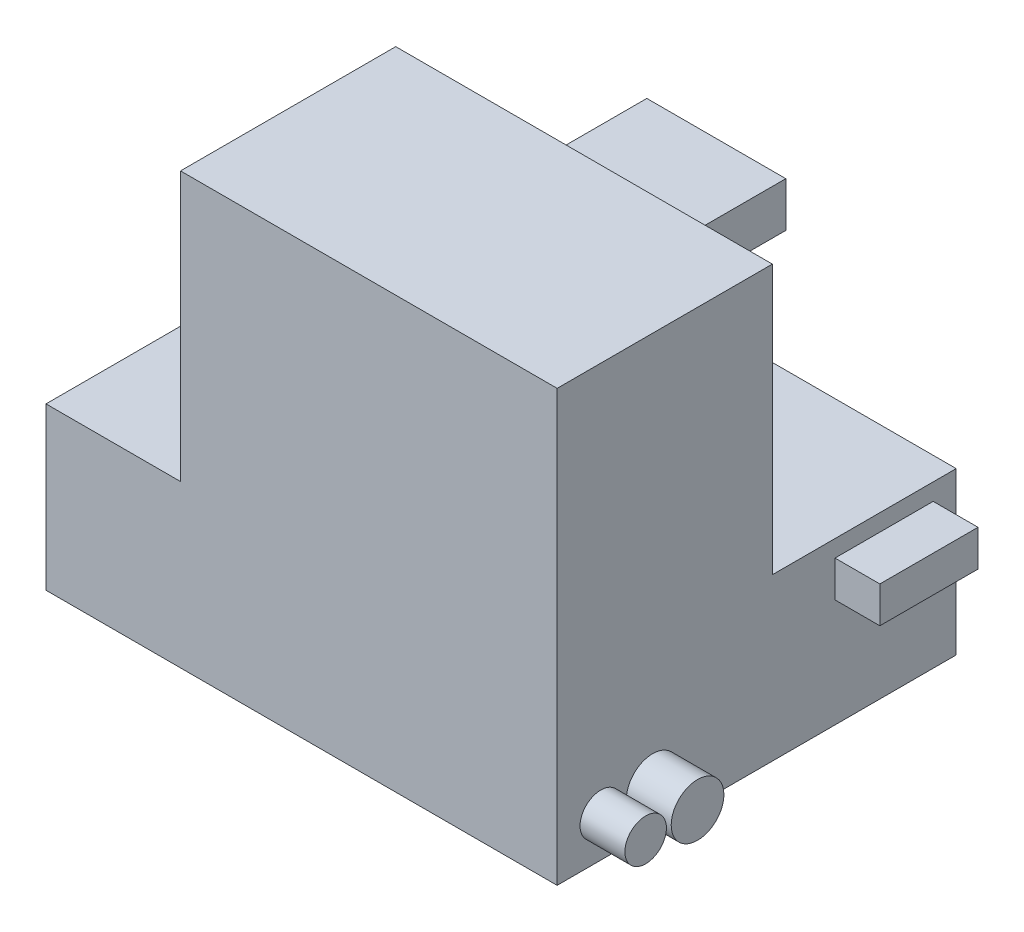
ISO-10303-21;
HEADER;
FILE_DESCRIPTION(('STEP AP214'),'2;1');
FILE_NAME('part.step','',(''),(''),'','','');
FILE_SCHEMA(('AUTOMOTIVE_DESIGN { 1 0 10303 214 1 1 1 1 }'));
ENDSEC;
DATA;
#1=APPLICATION_CONTEXT('core data for automotive mechanical design processes');
#2=APPLICATION_PROTOCOL_DEFINITION('international standard','automotive_design',2000,#1);
#3=PRODUCT_CONTEXT('',#1,'mechanical');
#4=PRODUCT('Part','Part','',(#3));
#5=PRODUCT_RELATED_PRODUCT_CATEGORY('part','',(#4));
#6=PRODUCT_DEFINITION_FORMATION('','',#4);
#7=PRODUCT_DEFINITION_CONTEXT('part definition',#1,'design');
#8=PRODUCT_DEFINITION('design','',#6,#7);
#9=PRODUCT_DEFINITION_SHAPE('','',#8);
#10=(LENGTH_UNIT() NAMED_UNIT(*) SI_UNIT(.MILLI.,.METRE.));
#11=(NAMED_UNIT(*) PLANE_ANGLE_UNIT() SI_UNIT($,.RADIAN.));
#12=(NAMED_UNIT(*) SI_UNIT($,.STERADIAN.) SOLID_ANGLE_UNIT());
#13=UNCERTAINTY_MEASURE_WITH_UNIT(LENGTH_MEASURE(1.E-05),#10,'distance_accuracy_value','');
#14=(GEOMETRIC_REPRESENTATION_CONTEXT(3) GLOBAL_UNCERTAINTY_ASSIGNED_CONTEXT((#13)) GLOBAL_UNIT_ASSIGNED_CONTEXT((#10,
#11,#12)) REPRESENTATION_CONTEXT('',''));
#15=CARTESIAN_POINT('',(0.,0.,0.));
#16=DIRECTION('',(0.,0.,1.));
#17=DIRECTION('',(1.,0.,0.));
#18=AXIS2_PLACEMENT_3D('',#15,#16,#17);
#19=CARTESIAN_POINT('',(0.,18.,-44.5));
#20=DIRECTION('',(0.,0.,1.));
#21=DIRECTION('',(1.,0.,0.));
#22=AXIS2_PLACEMENT_3D('',#19,#20,#21);
#23=PLANE('',#22);
#24=DIRECTION('',(-1.,0.,0.));
#25=VECTOR('',#24,1.);
#26=CARTESIAN_POINT('',(0.,0.,-44.5));
#27=LINE('',#26,#25);
#28=CARTESIAN_POINT('',(57.,0.,-44.5));
#29=VERTEX_POINT('',#28);
#30=CARTESIAN_POINT('',(0.,0.,-44.5));
#31=VERTEX_POINT('',#30);
#32=EDGE_CURVE('E230',#29,#31,#27,.T.);
#33=ORIENTED_EDGE('',*,*,#32,.T.);
#34=DIRECTION('',(0.,-1.,0.));
#35=VECTOR('',#34,1.);
#36=CARTESIAN_POINT('',(0.,18.,-44.5));
#37=LINE('',#36,#35);
#38=CARTESIAN_POINT('',(0.,18.,-44.5));
#39=VERTEX_POINT('',#38);
#40=EDGE_CURVE('E221',#39,#31,#37,.T.);
#41=ORIENTED_EDGE('',*,*,#40,.F.);
#42=DIRECTION('',(-1.,0.,0.));
#43=VECTOR('',#42,1.);
#44=CARTESIAN_POINT('',(0.,18.,-44.5));
#45=LINE('',#44,#43);
#46=CARTESIAN_POINT('',(57.,18.,-44.5));
#47=VERTEX_POINT('',#46);
#48=EDGE_CURVE('E213',#47,#39,#45,.T.);
#49=ORIENTED_EDGE('',*,*,#48,.F.);
#50=DIRECTION('',(0.,-1.,0.));
#51=VECTOR('',#50,1.);
#52=CARTESIAN_POINT('',(57.,18.,-44.5));
#53=LINE('',#52,#51);
#54=EDGE_CURVE('E235',#47,#29,#53,.T.);
#55=ORIENTED_EDGE('',*,*,#54,.T.);
#56=EDGE_LOOP('',(#33,#41,#49,#55));
#57=FACE_BOUND('',#56,.T.);
#58=DIRECTION('',(0.,-1.,0.));
#59=VECTOR('',#58,1.);
#60=CARTESIAN_POINT('',(18.,16.5,-44.5));
#61=LINE('',#60,#59);
#62=CARTESIAN_POINT('',(18.,16.5,-44.5));
#63=VERTEX_POINT('',#62);
#64=CARTESIAN_POINT('',(18.,11.5,-44.5));
#65=VERTEX_POINT('',#64);
#66=EDGE_CURVE('E162',#63,#65,#61,.T.);
#67=ORIENTED_EDGE('',*,*,#66,.F.);
#68=DIRECTION('',(1.,0.,0.));
#69=VECTOR('',#68,1.);
#70=CARTESIAN_POINT('',(18.,16.5,-44.5));
#71=LINE('',#70,#69);
#72=CARTESIAN_POINT('',(2.5,16.5,-44.5));
#73=VERTEX_POINT('',#72);
#74=EDGE_CURVE('E159',#73,#63,#71,.T.);
#75=ORIENTED_EDGE('',*,*,#74,.F.);
#76=DIRECTION('',(0.,1.,0.));
#77=VECTOR('',#76,1.);
#78=CARTESIAN_POINT('',(2.5,16.5,-44.5));
#79=LINE('',#78,#77);
#80=CARTESIAN_POINT('',(2.5,11.5,-44.5));
#81=VERTEX_POINT('',#80);
#82=EDGE_CURVE('E55',#81,#73,#79,.T.);
#83=ORIENTED_EDGE('',*,*,#82,.F.);
#84=DIRECTION('',(-1.,0.,0.));
#85=VECTOR('',#84,1.);
#86=CARTESIAN_POINT('',(18.,11.5,-44.5));
#87=LINE('',#86,#85);
#88=EDGE_CURVE('E50',#65,#81,#87,.T.);
#89=ORIENTED_EDGE('',*,*,#88,.F.);
#90=EDGE_LOOP('',(#67,#75,#83,#89));
#91=FACE_BOUND('',#90,.T.);
#92=ADVANCED_FACE('F33',(#57,#91),#23,.F.);
#93=CARTESIAN_POINT('',(0.,18.,0.));
#94=DIRECTION('',(0.,-1.,0.));
#95=DIRECTION('',(0.,0.,-1.));
#96=AXIS2_PLACEMENT_3D('',#93,#94,#95);
#97=PLANE('',#96);
#98=DIRECTION('',(0.,0.,1.));
#99=VECTOR('',#98,1.);
#100=CARTESIAN_POINT('',(15.,18.,0.));
#101=LINE('',#100,#99);
#102=CARTESIAN_POINT('',(15.,18.,-24.));
#103=VERTEX_POINT('',#102);
#104=CARTESIAN_POINT('',(15.,18.,0.));
#105=VERTEX_POINT('',#104);
#106=EDGE_CURVE('E166',#103,#105,#101,.T.);
#107=ORIENTED_EDGE('',*,*,#106,.F.);
#108=DIRECTION('',(-1.,0.,0.));
#109=VECTOR('',#108,1.);
#110=CARTESIAN_POINT('',(57.,18.,-24.));
#111=LINE('',#110,#109);
#112=CARTESIAN_POINT('',(57.,18.,-24.));
#113=VERTEX_POINT('',#112);
#114=EDGE_CURVE('E163',#113,#103,#111,.T.);
#115=ORIENTED_EDGE('',*,*,#114,.F.);
#116=DIRECTION('',(0.,0.,-1.));
#117=VECTOR('',#116,1.);
#118=CARTESIAN_POINT('',(57.,18.,0.));
#119=LINE('',#118,#117);
#120=EDGE_CURVE('E210',#113,#47,#119,.T.);
#121=ORIENTED_EDGE('',*,*,#120,.T.);
#122=ORIENTED_EDGE('',*,*,#48,.T.);
#123=DIRECTION('',(0.,0.,1.));
#124=VECTOR('',#123,1.);
#125=CARTESIAN_POINT('',(0.,18.,0.));
#126=LINE('',#125,#124);
#127=CARTESIAN_POINT('',(0.,18.,0.));
#128=VERTEX_POINT('',#127);
#129=EDGE_CURVE('E232',#39,#128,#126,.T.);
#130=ORIENTED_EDGE('',*,*,#129,.T.);
#131=DIRECTION('',(1.,0.,0.));
#132=VECTOR('',#131,1.);
#133=CARTESIAN_POINT('',(0.,18.,0.));
#134=LINE('',#133,#132);
#135=EDGE_CURVE('E214',#128,#105,#134,.T.);
#136=ORIENTED_EDGE('',*,*,#135,.T.);
#137=EDGE_LOOP('',(#107,#115,#121,#122,#130,#136));
#138=FACE_BOUND('',#137,.T.);
#139=ADVANCED_FACE('F252',(#138),#97,.F.);
#140=CARTESIAN_POINT('',(57.,18.,0.));
#141=DIRECTION('',(-1.,0.,0.));
#142=DIRECTION('',(0.,0.,1.));
#143=AXIS2_PLACEMENT_3D('',#140,#141,#142);
#144=PLANE('',#143);
#145=CARTESIAN_POINT('',(57.,4.45833877714819,-4.86994873122626));
#146=DIRECTION('',(-1.,0.,0.));
#147=DIRECTION('',(0.,0.,1.));
#148=AXIS2_PLACEMENT_3D('',#145,#146,#147);
#149=CIRCLE('',#148,2.3145559850235);
#150=CARTESIAN_POINT('',(57.,4.45833877714819,-2.55539274620276));
#151=VERTEX_POINT('',#150);
#152=EDGE_CURVE('E42',#151,#151,#149,.F.);
#153=ORIENTED_EDGE('',*,*,#152,.F.);
#154=EDGE_LOOP('',(#153));
#155=FACE_BOUND('',#154,.T.);
#156=DIRECTION('',(0.,0.,-1.));
#157=VECTOR('',#156,1.);
#158=CARTESIAN_POINT('',(57.,0.,0.));
#159=LINE('',#158,#157);
#160=CARTESIAN_POINT('',(57.,0.,0.));
#161=VERTEX_POINT('',#160);
#162=EDGE_CURVE('E228',#161,#29,#159,.T.);
#163=ORIENTED_EDGE('',*,*,#162,.T.);
#164=ORIENTED_EDGE('',*,*,#54,.F.);
#165=ORIENTED_EDGE('',*,*,#120,.F.);
#166=DIRECTION('',(0.,-1.,0.));
#167=VECTOR('',#166,1.);
#168=CARTESIAN_POINT('',(57.,48.,-24.));
#169=LINE('',#168,#167);
#170=CARTESIAN_POINT('',(57.,48.,-24.));
#171=VERTEX_POINT('',#170);
#172=EDGE_CURVE('E197',#171,#113,#169,.T.);
#173=ORIENTED_EDGE('',*,*,#172,.F.);
#174=DIRECTION('',(0.,0.,-1.));
#175=VECTOR('',#174,1.);
#176=CARTESIAN_POINT('',(57.,48.,0.));
#177=LINE('',#176,#175);
#178=CARTESIAN_POINT('',(57.,48.,0.));
#179=VERTEX_POINT('',#178);
#180=EDGE_CURVE('E172',#179,#171,#177,.T.);
#181=ORIENTED_EDGE('',*,*,#180,.F.);
#182=DIRECTION('',(0.,-1.,0.));
#183=VECTOR('',#182,1.);
#184=CARTESIAN_POINT('',(57.,18.,0.));
#185=LINE('',#184,#183);
#186=EDGE_CURVE('E238',#179,#161,#185,.T.);
#187=ORIENTED_EDGE('',*,*,#186,.T.);
#188=EDGE_LOOP('',(#163,#164,#165,#173,#181,#187));
#189=FACE_BOUND('',#188,.T.);
#190=DIRECTION('',(0.,-1.,0.));
#191=VECTOR('',#190,1.);
#192=CARTESIAN_POINT('',(57.,16.1165431801251,-30.9862310302975));
#193=LINE('',#192,#191);
#194=CARTESIAN_POINT('',(57.,16.1165431801251,-30.9862310302975));
#195=VERTEX_POINT('',#194);
#196=CARTESIAN_POINT('',(57.,12.0760948028291,-30.9862310302975));
#197=VERTEX_POINT('',#196);
#198=EDGE_CURVE('E259',#195,#197,#193,.T.);
#199=ORIENTED_EDGE('',*,*,#198,.F.);
#200=DIRECTION('',(0.,0.,1.));
#201=VECTOR('',#200,1.);
#202=CARTESIAN_POINT('',(57.,16.1165431801251,-30.9862310302975));
#203=LINE('',#202,#201);
#204=CARTESIAN_POINT('',(57.,16.1165431801251,-41.9313545719859));
#205=VERTEX_POINT('',#204);
#206=EDGE_CURVE('E321',#205,#195,#203,.T.);
#207=ORIENTED_EDGE('',*,*,#206,.F.);
#208=DIRECTION('',(0.,1.,0.));
#209=VECTOR('',#208,1.);
#210=CARTESIAN_POINT('',(57.,16.1165431801251,-41.9313545719859));
#211=LINE('',#210,#209);
#212=CARTESIAN_POINT('',(57.,12.0760948028291,-41.9313545719859));
#213=VERTEX_POINT('',#212);
#214=EDGE_CURVE('E324',#213,#205,#211,.T.);
#215=ORIENTED_EDGE('',*,*,#214,.F.);
#216=DIRECTION('',(0.,0.,-1.));
#217=VECTOR('',#216,1.);
#218=CARTESIAN_POINT('',(57.,12.0760948028291,-30.9862310302975));
#219=LINE('',#218,#217);
#220=EDGE_CURVE('E327',#197,#213,#219,.T.);
#221=ORIENTED_EDGE('',*,*,#220,.F.);
#222=EDGE_LOOP('',(#199,#207,#215,#221));
#223=FACE_BOUND('',#222,.T.);
#224=CARTESIAN_POINT('',(57.,4.45833877714819,-10.6563386937779));
#225=DIRECTION('',(-1.,0.,0.));
#226=DIRECTION('',(0.,0.,1.));
#227=AXIS2_PLACEMENT_3D('',#224,#225,#226);
#228=CIRCLE('',#227,2.9372509191897);
#229=CARTESIAN_POINT('',(57.,4.45833877714819,-7.71908777458821));
#230=VERTEX_POINT('',#229);
#231=EDGE_CURVE('E11',#230,#230,#228,.F.);
#232=ORIENTED_EDGE('',*,*,#231,.F.);
#233=EDGE_LOOP('',(#232));
#234=FACE_BOUND('',#233,.T.);
#235=ADVANCED_FACE('F249',(#155,#189,#223,#234),#144,.F.);
#236=CARTESIAN_POINT('',(0.,18.,0.));
#237=DIRECTION('',(1.,0.,0.));
#238=DIRECTION('',(0.,0.,-1.));
#239=AXIS2_PLACEMENT_3D('',#236,#237,#238);
#240=PLANE('',#239);
#241=DIRECTION('',(0.,0.,1.));
#242=VECTOR('',#241,1.);
#243=CARTESIAN_POINT('',(0.,0.,0.));
#244=LINE('',#243,#242);
#245=CARTESIAN_POINT('',(0.,0.,0.));
#246=VERTEX_POINT('',#245);
#247=EDGE_CURVE('E222',#31,#246,#244,.T.);
#248=ORIENTED_EDGE('',*,*,#247,.T.);
#249=DIRECTION('',(0.,-1.,0.));
#250=VECTOR('',#249,1.);
#251=CARTESIAN_POINT('',(0.,18.,0.));
#252=LINE('',#251,#250);
#253=EDGE_CURVE('E241',#128,#246,#252,.T.);
#254=ORIENTED_EDGE('',*,*,#253,.F.);
#255=ORIENTED_EDGE('',*,*,#129,.F.);
#256=ORIENTED_EDGE('',*,*,#40,.T.);
#257=EDGE_LOOP('',(#248,#254,#255,#256));
#258=FACE_BOUND('',#257,.T.);
#259=ADVANCED_FACE('F35',(#258),#240,.F.);
#260=CARTESIAN_POINT('',(0.,18.,0.));
#261=DIRECTION('',(0.,0.,-1.));
#262=DIRECTION('',(-1.,0.,0.));
#263=AXIS2_PLACEMENT_3D('',#260,#261,#262);
#264=PLANE('',#263);
#265=DIRECTION('',(1.,0.,0.));
#266=VECTOR('',#265,1.);
#267=CARTESIAN_POINT('',(0.,0.,0.));
#268=LINE('',#267,#266);
#269=EDGE_CURVE('E225',#246,#161,#268,.T.);
#270=ORIENTED_EDGE('',*,*,#269,.T.);
#271=ORIENTED_EDGE('',*,*,#186,.F.);
#272=DIRECTION('',(1.,0.,0.));
#273=VECTOR('',#272,1.);
#274=CARTESIAN_POINT('',(57.,48.,0.));
#275=LINE('',#274,#273);
#276=CARTESIAN_POINT('',(15.,48.,0.));
#277=VERTEX_POINT('',#276);
#278=EDGE_CURVE('E179',#277,#179,#275,.T.);
#279=ORIENTED_EDGE('',*,*,#278,.F.);
#280=DIRECTION('',(0.,-1.,0.));
#281=VECTOR('',#280,1.);
#282=CARTESIAN_POINT('',(15.,48.,0.));
#283=LINE('',#282,#281);
#284=EDGE_CURVE('E182',#277,#105,#283,.T.);
#285=ORIENTED_EDGE('',*,*,#284,.T.);
#286=ORIENTED_EDGE('',*,*,#135,.F.);
#287=ORIENTED_EDGE('',*,*,#253,.T.);
#288=EDGE_LOOP('',(#270,#271,#279,#285,#286,#287));
#289=FACE_BOUND('',#288,.T.);
#290=ADVANCED_FACE('F289',(#289),#264,.F.);
#291=CARTESIAN_POINT('',(0.,0.,0.));
#292=DIRECTION('',(0.,-1.,0.));
#293=DIRECTION('',(0.,0.,-1.));
#294=AXIS2_PLACEMENT_3D('',#291,#292,#293);
#295=PLANE('',#294);
#296=CARTESIAN_POINT('',(53.19,0.,-19.05));
#297=DIRECTION('',(0.,-1.,0.));
#298=DIRECTION('',(0.,0.,-1.));
#299=AXIS2_PLACEMENT_3D('',#296,#297,#298);
#300=CIRCLE('',#299,1.7);
#301=CARTESIAN_POINT('',(53.19,0.,-20.75));
#302=VERTEX_POINT('',#301);
#303=EDGE_CURVE('E574',#302,#302,#300,.T.);
#304=ORIENTED_EDGE('',*,*,#303,.F.);
#305=EDGE_LOOP('',(#304));
#306=FACE_BOUND('',#305,.T.);
#307=CARTESIAN_POINT('',(16.36,0.,-40.64));
#308=DIRECTION('',(0.,-1.,0.));
#309=DIRECTION('',(0.,0.,-1.));
#310=AXIS2_PLACEMENT_3D('',#307,#308,#309);
#311=CIRCLE('',#310,1.7);
#312=CARTESIAN_POINT('',(16.36,0.,-42.34));
#313=VERTEX_POINT('',#312);
#314=EDGE_CURVE('E573',#313,#313,#311,.T.);
#315=ORIENTED_EDGE('',*,*,#314,.F.);
#316=EDGE_LOOP('',(#315));
#317=FACE_BOUND('',#316,.T.);
#318=CARTESIAN_POINT('',(3.66,0.,-3.81));
#319=DIRECTION('',(0.,-1.,0.));
#320=DIRECTION('',(0.,0.,-1.));
#321=AXIS2_PLACEMENT_3D('',#318,#319,#320);
#322=CIRCLE('',#321,1.7);
#323=CARTESIAN_POINT('',(3.66,0.,-5.51));
#324=VERTEX_POINT('',#323);
#325=EDGE_CURVE('E583',#324,#324,#322,.T.);
#326=ORIENTED_EDGE('',*,*,#325,.F.);
#327=EDGE_LOOP('',(#326));
#328=FACE_BOUND('',#327,.T.);
#329=ORIENTED_EDGE('',*,*,#247,.F.);
#330=ORIENTED_EDGE('',*,*,#32,.F.);
#331=ORIENTED_EDGE('',*,*,#162,.F.);
#332=ORIENTED_EDGE('',*,*,#269,.F.);
#333=EDGE_LOOP('',(#329,#330,#331,#332));
#334=FACE_BOUND('',#333,.T.);
#335=ADVANCED_FACE('F288',(#306,#317,#328,#334),#295,.T.);
#336=CARTESIAN_POINT('',(62.,16.1165431801251,-30.9862310302975));
#337=DIRECTION('',(0.,0.,-1.));
#338=DIRECTION('',(-1.,0.,0.));
#339=AXIS2_PLACEMENT_3D('',#336,#337,#338);
#340=PLANE('',#339);
#341=ORIENTED_EDGE('',*,*,#198,.T.);
#342=DIRECTION('',(-1.,0.,0.));
#343=VECTOR('',#342,1.);
#344=CARTESIAN_POINT('',(62.,12.0760948028291,-30.9862310302975));
#345=LINE('',#344,#343);
#346=CARTESIAN_POINT('',(62.,12.0760948028291,-30.9862310302975));
#347=VERTEX_POINT('',#346);
#348=EDGE_CURVE('E226',#347,#197,#345,.T.);
#349=ORIENTED_EDGE('',*,*,#348,.F.);
#350=DIRECTION('',(0.,-1.,0.));
#351=VECTOR('',#350,1.);
#352=CARTESIAN_POINT('',(62.,16.1165431801251,-30.9862310302975));
#353=LINE('',#352,#351);
#354=CARTESIAN_POINT('',(62.,16.1165431801251,-30.9862310302975));
#355=VERTEX_POINT('',#354);
#356=EDGE_CURVE('E323',#355,#347,#353,.T.);
#357=ORIENTED_EDGE('',*,*,#356,.F.);
#358=DIRECTION('',(-1.,0.,0.));
#359=VECTOR('',#358,1.);
#360=CARTESIAN_POINT('',(62.,16.1165431801251,-30.9862310302975));
#361=LINE('',#360,#359);
#362=EDGE_CURVE('E317',#355,#195,#361,.T.);
#363=ORIENTED_EDGE('',*,*,#362,.T.);
#364=EDGE_LOOP('',(#341,#349,#357,#363));
#365=FACE_BOUND('',#364,.T.);
#366=ADVANCED_FACE('F296',(#365),#340,.F.);
#367=CARTESIAN_POINT('',(62.,12.0760948028291,-30.9862310302975));
#368=DIRECTION('',(0.,1.,0.));
#369=DIRECTION('',(0.,0.,1.));
#370=AXIS2_PLACEMENT_3D('',#367,#368,#369);
#371=PLANE('',#370);
#372=ORIENTED_EDGE('',*,*,#220,.T.);
#373=DIRECTION('',(-1.,0.,0.));
#374=VECTOR('',#373,1.);
#375=CARTESIAN_POINT('',(62.,12.0760948028291,-41.9313545719859));
#376=LINE('',#375,#374);
#377=CARTESIAN_POINT('',(62.,12.0760948028291,-41.9313545719859));
#378=VERTEX_POINT('',#377);
#379=EDGE_CURVE('E311',#378,#213,#376,.T.);
#380=ORIENTED_EDGE('',*,*,#379,.F.);
#381=DIRECTION('',(0.,0.,-1.));
#382=VECTOR('',#381,1.);
#383=CARTESIAN_POINT('',(62.,12.0760948028291,-30.9862310302975));
#384=LINE('',#383,#382);
#385=EDGE_CURVE('E334',#347,#378,#384,.T.);
#386=ORIENTED_EDGE('',*,*,#385,.F.);
#387=ORIENTED_EDGE('',*,*,#348,.T.);
#388=EDGE_LOOP('',(#372,#380,#386,#387));
#389=FACE_BOUND('',#388,.T.);
#390=ADVANCED_FACE('F357',(#389),#371,.F.);
#391=CARTESIAN_POINT('',(62.,16.1165431801251,-41.9313545719859));
#392=DIRECTION('',(0.,0.,1.));
#393=DIRECTION('',(1.,0.,0.));
#394=AXIS2_PLACEMENT_3D('',#391,#392,#393);
#395=PLANE('',#394);
#396=ORIENTED_EDGE('',*,*,#214,.T.);
#397=DIRECTION('',(-1.,0.,0.));
#398=VECTOR('',#397,1.);
#399=CARTESIAN_POINT('',(62.,16.1165431801251,-41.9313545719859));
#400=LINE('',#399,#398);
#401=CARTESIAN_POINT('',(62.,16.1165431801251,-41.9313545719859));
#402=VERTEX_POINT('',#401);
#403=EDGE_CURVE('E314',#402,#205,#400,.T.);
#404=ORIENTED_EDGE('',*,*,#403,.F.);
#405=DIRECTION('',(0.,1.,0.));
#406=VECTOR('',#405,1.);
#407=CARTESIAN_POINT('',(62.,16.1165431801251,-41.9313545719859));
#408=LINE('',#407,#406);
#409=EDGE_CURVE('E332',#378,#402,#408,.T.);
#410=ORIENTED_EDGE('',*,*,#409,.F.);
#411=ORIENTED_EDGE('',*,*,#379,.T.);
#412=EDGE_LOOP('',(#396,#404,#410,#411));
#413=FACE_BOUND('',#412,.T.);
#414=ADVANCED_FACE('F353',(#413),#395,.F.);
#415=CARTESIAN_POINT('',(62.,16.1165431801251,-30.9862310302975));
#416=DIRECTION('',(0.,-1.,0.));
#417=DIRECTION('',(0.,0.,-1.));
#418=AXIS2_PLACEMENT_3D('',#415,#416,#417);
#419=PLANE('',#418);
#420=ORIENTED_EDGE('',*,*,#206,.T.);
#421=ORIENTED_EDGE('',*,*,#362,.F.);
#422=DIRECTION('',(0.,0.,1.));
#423=VECTOR('',#422,1.);
#424=CARTESIAN_POINT('',(62.,16.1165431801251,-30.9862310302975));
#425=LINE('',#424,#423);
#426=EDGE_CURVE('E320',#402,#355,#425,.T.);
#427=ORIENTED_EDGE('',*,*,#426,.F.);
#428=ORIENTED_EDGE('',*,*,#403,.T.);
#429=EDGE_LOOP('',(#420,#421,#427,#428));
#430=FACE_BOUND('',#429,.T.);
#431=ADVANCED_FACE('F347',(#430),#419,.F.);
#432=CARTESIAN_POINT('',(62.,0.,0.));
#433=DIRECTION('',(1.,0.,0.));
#434=DIRECTION('',(0.,0.,-1.));
#435=AXIS2_PLACEMENT_3D('',#432,#433,#434);
#436=PLANE('',#435);
#437=ORIENTED_EDGE('',*,*,#356,.T.);
#438=ORIENTED_EDGE('',*,*,#385,.T.);
#439=ORIENTED_EDGE('',*,*,#409,.T.);
#440=ORIENTED_EDGE('',*,*,#426,.T.);
#441=EDGE_LOOP('',(#437,#438,#439,#440));
#442=FACE_BOUND('',#441,.T.);
#443=ADVANCED_FACE('F342',(#442),#436,.T.);
#444=CARTESIAN_POINT('',(62.,4.45833877714819,-4.86994873122626));
#445=DIRECTION('',(-1.,0.,0.));
#446=DIRECTION('',(0.,0.,1.));
#447=AXIS2_PLACEMENT_3D('',#444,#445,#446);
#448=CYLINDRICAL_SURFACE('',#447,2.3145559850235);
#449=CARTESIAN_POINT('',(62.,4.45833877714819,-4.86994873122626));
#450=DIRECTION('',(1.,0.,0.));
#451=DIRECTION('',(0.,0.,-1.));
#452=AXIS2_PLACEMENT_3D('',#449,#450,#451);
#453=CIRCLE('',#452,2.3145559850235);
#454=CARTESIAN_POINT('',(62.,4.45833877714819,-7.18450471624976));
#455=VERTEX_POINT('',#454);
#456=EDGE_CURVE('E206',#455,#455,#453,.T.);
#457=ORIENTED_EDGE('',*,*,#456,.F.);
#458=EDGE_LOOP('',(#457));
#459=FACE_BOUND('',#458,.T.);
#460=ORIENTED_EDGE('',*,*,#152,.T.);
#461=EDGE_LOOP('',(#460));
#462=FACE_BOUND('',#461,.T.);
#463=ADVANCED_FACE('F247',(#459,#462),#448,.T.);
#464=CARTESIAN_POINT('',(62.,4.45833877714819,-4.86994873122626));
#465=DIRECTION('',(1.,0.,0.));
#466=DIRECTION('',(0.,0.,-1.));
#467=AXIS2_PLACEMENT_3D('',#464,#465,#466);
#468=PLANE('',#467);
#469=ORIENTED_EDGE('',*,*,#456,.T.);
#470=EDGE_LOOP('',(#469));
#471=FACE_BOUND('',#470,.T.);
#472=ADVANCED_FACE('F266',(#471),#468,.T.);
#473=CARTESIAN_POINT('',(62.,4.45833877714819,-10.6563386937779));
#474=DIRECTION('',(-1.,0.,0.));
#475=DIRECTION('',(0.,0.,1.));
#476=AXIS2_PLACEMENT_3D('',#473,#474,#475);
#477=CYLINDRICAL_SURFACE('',#476,2.9372509191897);
#478=CARTESIAN_POINT('',(62.,4.45833877714819,-10.6563386937779));
#479=DIRECTION('',(1.,0.,0.));
#480=DIRECTION('',(0.,0.,-1.));
#481=AXIS2_PLACEMENT_3D('',#478,#479,#480);
#482=CIRCLE('',#481,2.9372509191897);
#483=CARTESIAN_POINT('',(62.,4.45833877714819,-13.5935896129676));
#484=VERTEX_POINT('',#483);
#485=EDGE_CURVE('E202',#484,#484,#482,.T.);
#486=ORIENTED_EDGE('',*,*,#485,.F.);
#487=EDGE_LOOP('',(#486));
#488=FACE_BOUND('',#487,.T.);
#489=ORIENTED_EDGE('',*,*,#231,.T.);
#490=EDGE_LOOP('',(#489));
#491=FACE_BOUND('',#490,.T.);
#492=ADVANCED_FACE('F263',(#488,#491),#477,.T.);
#493=CARTESIAN_POINT('',(62.,4.45833877714819,-10.6563386937779));
#494=DIRECTION('',(1.,0.,0.));
#495=DIRECTION('',(0.,0.,-1.));
#496=AXIS2_PLACEMENT_3D('',#493,#494,#495);
#497=PLANE('',#496);
#498=ORIENTED_EDGE('',*,*,#485,.T.);
#499=EDGE_LOOP('',(#498));
#500=FACE_BOUND('',#499,.T.);
#501=ADVANCED_FACE('F265',(#500),#497,.T.);
#502=CARTESIAN_POINT('',(57.,48.,-24.));
#503=DIRECTION('',(0.,0.,1.));
#504=DIRECTION('',(1.,0.,0.));
#505=AXIS2_PLACEMENT_3D('',#502,#503,#504);
#506=PLANE('',#505);
#507=ORIENTED_EDGE('',*,*,#114,.T.);
#508=DIRECTION('',(0.,-1.,0.));
#509=VECTOR('',#508,1.);
#510=CARTESIAN_POINT('',(15.,48.,-24.));
#511=LINE('',#510,#509);
#512=CARTESIAN_POINT('',(15.,48.,-24.));
#513=VERTEX_POINT('',#512);
#514=EDGE_CURVE('E185',#513,#103,#511,.T.);
#515=ORIENTED_EDGE('',*,*,#514,.F.);
#516=DIRECTION('',(-1.,0.,0.));
#517=VECTOR('',#516,1.);
#518=CARTESIAN_POINT('',(57.,48.,-24.));
#519=LINE('',#518,#517);
#520=EDGE_CURVE('E175',#171,#513,#519,.T.);
#521=ORIENTED_EDGE('',*,*,#520,.F.);
#522=ORIENTED_EDGE('',*,*,#172,.T.);
#523=EDGE_LOOP('',(#507,#515,#521,#522));
#524=FACE_BOUND('',#523,.T.);
#525=ADVANCED_FACE('F273',(#524),#506,.F.);
#526=CARTESIAN_POINT('',(15.,48.,0.));
#527=DIRECTION('',(1.,0.,0.));
#528=DIRECTION('',(0.,0.,-1.));
#529=AXIS2_PLACEMENT_3D('',#526,#527,#528);
#530=PLANE('',#529);
#531=ORIENTED_EDGE('',*,*,#106,.T.);
#532=ORIENTED_EDGE('',*,*,#284,.F.);
#533=DIRECTION('',(0.,0.,1.));
#534=VECTOR('',#533,1.);
#535=CARTESIAN_POINT('',(15.,48.,0.));
#536=LINE('',#535,#534);
#537=EDGE_CURVE('E177',#513,#277,#536,.T.);
#538=ORIENTED_EDGE('',*,*,#537,.F.);
#539=ORIENTED_EDGE('',*,*,#514,.T.);
#540=EDGE_LOOP('',(#531,#532,#538,#539));
#541=FACE_BOUND('',#540,.T.);
#542=ADVANCED_FACE('F439',(#541),#530,.F.);
#543=CARTESIAN_POINT('',(0.,48.,0.));
#544=DIRECTION('',(0.,1.,0.));
#545=DIRECTION('',(0.,0.,1.));
#546=AXIS2_PLACEMENT_3D('',#543,#544,#545);
#547=PLANE('',#546);
#548=ORIENTED_EDGE('',*,*,#180,.T.);
#549=ORIENTED_EDGE('',*,*,#520,.T.);
#550=ORIENTED_EDGE('',*,*,#537,.T.);
#551=ORIENTED_EDGE('',*,*,#278,.T.);
#552=EDGE_LOOP('',(#548,#549,#550,#551));
#553=FACE_BOUND('',#552,.T.);
#554=ADVANCED_FACE('F448',(#553),#547,.T.);
#555=CARTESIAN_POINT('',(18.,16.5,-64.5));
#556=DIRECTION('',(-1.,0.,0.));
#557=DIRECTION('',(0.,0.,1.));
#558=AXIS2_PLACEMENT_3D('',#555,#556,#557);
#559=PLANE('',#558);
#560=ORIENTED_EDGE('',*,*,#66,.T.);
#561=DIRECTION('',(0.,0.,1.));
#562=VECTOR('',#561,1.);
#563=CARTESIAN_POINT('',(18.,11.5,-64.5));
#564=LINE('',#563,#562);
#565=CARTESIAN_POINT('',(18.,11.5,-64.5));
#566=VERTEX_POINT('',#565);
#567=EDGE_CURVE('E143',#566,#65,#564,.T.);
#568=ORIENTED_EDGE('',*,*,#567,.F.);
#569=DIRECTION('',(0.,-1.,0.));
#570=VECTOR('',#569,1.);
#571=CARTESIAN_POINT('',(18.,16.5,-64.5));
#572=LINE('',#571,#570);
#573=CARTESIAN_POINT('',(18.,16.5,-64.5));
#574=VERTEX_POINT('',#573);
#575=EDGE_CURVE('E150',#574,#566,#572,.T.);
#576=ORIENTED_EDGE('',*,*,#575,.F.);
#577=DIRECTION('',(0.,0.,1.));
#578=VECTOR('',#577,1.);
#579=CARTESIAN_POINT('',(18.,16.5,-64.5));
#580=LINE('',#579,#578);
#581=EDGE_CURVE('E592',#574,#63,#580,.T.);
#582=ORIENTED_EDGE('',*,*,#581,.T.);
#583=EDGE_LOOP('',(#560,#568,#576,#582));
#584=FACE_BOUND('',#583,.T.);
#585=ADVANCED_FACE('F161',(#584),#559,.F.);
#586=CARTESIAN_POINT('',(18.,11.5,-64.5));
#587=DIRECTION('',(0.,1.,0.));
#588=DIRECTION('',(0.,0.,1.));
#589=AXIS2_PLACEMENT_3D('',#586,#587,#588);
#590=PLANE('',#589);
#591=ORIENTED_EDGE('',*,*,#88,.T.);
#592=DIRECTION('',(0.,0.,1.));
#593=VECTOR('',#592,1.);
#594=CARTESIAN_POINT('',(2.5,11.5,-64.5));
#595=LINE('',#594,#593);
#596=CARTESIAN_POINT('',(2.5,11.5,-64.5));
#597=VERTEX_POINT('',#596);
#598=EDGE_CURVE('E146',#597,#81,#595,.T.);
#599=ORIENTED_EDGE('',*,*,#598,.F.);
#600=DIRECTION('',(-1.,0.,0.));
#601=VECTOR('',#600,1.);
#602=CARTESIAN_POINT('',(18.,11.5,-64.5));
#603=LINE('',#602,#601);
#604=EDGE_CURVE('E139',#566,#597,#603,.T.);
#605=ORIENTED_EDGE('',*,*,#604,.F.);
#606=ORIENTED_EDGE('',*,*,#567,.T.);
#607=EDGE_LOOP('',(#591,#599,#605,#606));
#608=FACE_BOUND('',#607,.T.);
#609=ADVANCED_FACE('F141',(#608),#590,.F.);
#610=CARTESIAN_POINT('',(2.5,16.5,-64.5));
#611=DIRECTION('',(1.,0.,0.));
#612=DIRECTION('',(0.,0.,-1.));
#613=AXIS2_PLACEMENT_3D('',#610,#611,#612);
#614=PLANE('',#613);
#615=ORIENTED_EDGE('',*,*,#82,.T.);
#616=DIRECTION('',(0.,0.,1.));
#617=VECTOR('',#616,1.);
#618=CARTESIAN_POINT('',(2.5,16.5,-64.5));
#619=LINE('',#618,#617);
#620=CARTESIAN_POINT('',(2.5,16.5,-64.5));
#621=VERTEX_POINT('',#620);
#622=EDGE_CURVE('E168',#621,#73,#619,.T.);
#623=ORIENTED_EDGE('',*,*,#622,.F.);
#624=DIRECTION('',(0.,1.,0.));
#625=VECTOR('',#624,1.);
#626=CARTESIAN_POINT('',(2.5,16.5,-64.5));
#627=LINE('',#626,#625);
#628=EDGE_CURVE('E149',#597,#621,#627,.T.);
#629=ORIENTED_EDGE('',*,*,#628,.F.);
#630=ORIENTED_EDGE('',*,*,#598,.T.);
#631=EDGE_LOOP('',(#615,#623,#629,#630));
#632=FACE_BOUND('',#631,.T.);
#633=ADVANCED_FACE('F478',(#632),#614,.F.);
#634=CARTESIAN_POINT('',(18.,16.5,-64.5));
#635=DIRECTION('',(0.,-1.,0.));
#636=DIRECTION('',(0.,0.,-1.));
#637=AXIS2_PLACEMENT_3D('',#634,#635,#636);
#638=PLANE('',#637);
#639=ORIENTED_EDGE('',*,*,#74,.T.);
#640=ORIENTED_EDGE('',*,*,#581,.F.);
#641=DIRECTION('',(1.,0.,0.));
#642=VECTOR('',#641,1.);
#643=CARTESIAN_POINT('',(18.,16.5,-64.5));
#644=LINE('',#643,#642);
#645=EDGE_CURVE('E155',#621,#574,#644,.T.);
#646=ORIENTED_EDGE('',*,*,#645,.F.);
#647=ORIENTED_EDGE('',*,*,#622,.T.);
#648=EDGE_LOOP('',(#639,#640,#646,#647));
#649=FACE_BOUND('',#648,.T.);
#650=ADVANCED_FACE('F487',(#649),#638,.F.);
#651=CARTESIAN_POINT('',(0.,0.,-64.5));
#652=DIRECTION('',(0.,0.,-1.));
#653=DIRECTION('',(-1.,0.,0.));
#654=AXIS2_PLACEMENT_3D('',#651,#652,#653);
#655=PLANE('',#654);
#656=ORIENTED_EDGE('',*,*,#575,.T.);
#657=ORIENTED_EDGE('',*,*,#604,.T.);
#658=ORIENTED_EDGE('',*,*,#628,.T.);
#659=ORIENTED_EDGE('',*,*,#645,.T.);
#660=EDGE_LOOP('',(#656,#657,#658,#659));
#661=FACE_BOUND('',#660,.T.);
#662=ADVANCED_FACE('F153',(#661),#655,.T.);
#663=CARTESIAN_POINT('',(3.66,10.,-3.81));
#664=DIRECTION('',(0.,-1.,0.));
#665=DIRECTION('',(0.,0.,-1.));
#666=AXIS2_PLACEMENT_3D('',#663,#664,#665);
#667=CYLINDRICAL_SURFACE('',#666,1.7);
#668=CARTESIAN_POINT('',(3.66,10.,-3.81));
#669=DIRECTION('',(0.,-1.,0.));
#670=DIRECTION('',(0.,0.,-1.));
#671=AXIS2_PLACEMENT_3D('',#668,#669,#670);
#672=CIRCLE('',#671,1.7);
#673=CARTESIAN_POINT('',(3.66,10.,-5.51));
#674=VERTEX_POINT('',#673);
#675=EDGE_CURVE('E585',#674,#674,#672,.T.);
#676=ORIENTED_EDGE('',*,*,#675,.F.);
#677=EDGE_LOOP('',(#676));
#678=FACE_BOUND('',#677,.T.);
#679=ORIENTED_EDGE('',*,*,#325,.T.);
#680=EDGE_LOOP('',(#679));
#681=FACE_BOUND('',#680,.T.);
#682=ADVANCED_FACE('F505',(#678,#681),#667,.F.);
#683=CARTESIAN_POINT('',(3.66,10.,-3.81));
#684=DIRECTION('',(0.,-1.,0.));
#685=DIRECTION('',(0.,0.,-1.));
#686=AXIS2_PLACEMENT_3D('',#683,#684,#685);
#687=PLANE('',#686);
#688=ORIENTED_EDGE('',*,*,#675,.T.);
#689=EDGE_LOOP('',(#688));
#690=FACE_BOUND('',#689,.T.);
#691=ADVANCED_FACE('F516',(#690),#687,.T.);
#692=CARTESIAN_POINT('',(16.36,10.,-40.64));
#693=DIRECTION('',(0.,-1.,0.));
#694=DIRECTION('',(0.,0.,-1.));
#695=AXIS2_PLACEMENT_3D('',#692,#693,#694);
#696=CYLINDRICAL_SURFACE('',#695,1.7);
#697=CARTESIAN_POINT('',(16.36,10.,-40.64));
#698=DIRECTION('',(0.,-1.,0.));
#699=DIRECTION('',(0.,0.,-1.));
#700=AXIS2_PLACEMENT_3D('',#697,#698,#699);
#701=CIRCLE('',#700,1.7);
#702=CARTESIAN_POINT('',(16.36,10.,-42.34));
#703=VERTEX_POINT('',#702);
#704=EDGE_CURVE('E577',#703,#703,#701,.T.);
#705=ORIENTED_EDGE('',*,*,#704,.F.);
#706=EDGE_LOOP('',(#705));
#707=FACE_BOUND('',#706,.T.);
#708=ORIENTED_EDGE('',*,*,#314,.T.);
#709=EDGE_LOOP('',(#708));
#710=FACE_BOUND('',#709,.T.);
#711=ADVANCED_FACE('F526',(#707,#710),#696,.F.);
#712=CARTESIAN_POINT('',(16.36,10.,-40.64));
#713=DIRECTION('',(0.,-1.,0.));
#714=DIRECTION('',(0.,0.,-1.));
#715=AXIS2_PLACEMENT_3D('',#712,#713,#714);
#716=PLANE('',#715);
#717=ORIENTED_EDGE('',*,*,#704,.T.);
#718=EDGE_LOOP('',(#717));
#719=FACE_BOUND('',#718,.T.);
#720=ADVANCED_FACE('F536',(#719),#716,.T.);
#721=CARTESIAN_POINT('',(53.19,10.,-19.05));
#722=DIRECTION('',(0.,-1.,0.));
#723=DIRECTION('',(0.,0.,-1.));
#724=AXIS2_PLACEMENT_3D('',#721,#722,#723);
#725=CYLINDRICAL_SURFACE('',#724,1.7);
#726=CARTESIAN_POINT('',(53.19,10.,-19.05));
#727=DIRECTION('',(0.,-1.,0.));
#728=DIRECTION('',(0.,0.,-1.));
#729=AXIS2_PLACEMENT_3D('',#726,#727,#728);
#730=CIRCLE('',#729,1.7);
#731=CARTESIAN_POINT('',(53.19,10.,-20.75));
#732=VERTEX_POINT('',#731);
#733=EDGE_CURVE('E572',#732,#732,#730,.T.);
#734=ORIENTED_EDGE('',*,*,#733,.F.);
#735=EDGE_LOOP('',(#734));
#736=FACE_BOUND('',#735,.T.);
#737=ORIENTED_EDGE('',*,*,#303,.T.);
#738=EDGE_LOOP('',(#737));
#739=FACE_BOUND('',#738,.T.);
#740=ADVANCED_FACE('F546',(#736,#739),#725,.F.);
#741=CARTESIAN_POINT('',(53.19,10.,-19.05));
#742=DIRECTION('',(0.,-1.,0.));
#743=DIRECTION('',(0.,0.,-1.));
#744=AXIS2_PLACEMENT_3D('',#741,#742,#743);
#745=PLANE('',#744);
#746=ORIENTED_EDGE('',*,*,#733,.T.);
#747=EDGE_LOOP('',(#746));
#748=FACE_BOUND('',#747,.T.);
#749=ADVANCED_FACE('F556',(#748),#745,.T.);
#750=CLOSED_SHELL('',(#92,#139,#235,#259,#290,#335,#366,#390,#414,#431,#443,#463,#472,#492,#501,
#525,#542,#554,#585,#609,#633,#650,#662,#682,#691,#711,#720,#740,#749));
#751=MANIFOLD_SOLID_BREP('B2',#750);
#752=ADVANCED_BREP_SHAPE_REPRESENTATION('',(#18,#751),#14);
#753=SHAPE_DEFINITION_REPRESENTATION(#9,#752);
ENDSEC;
END-ISO-10303-21;
